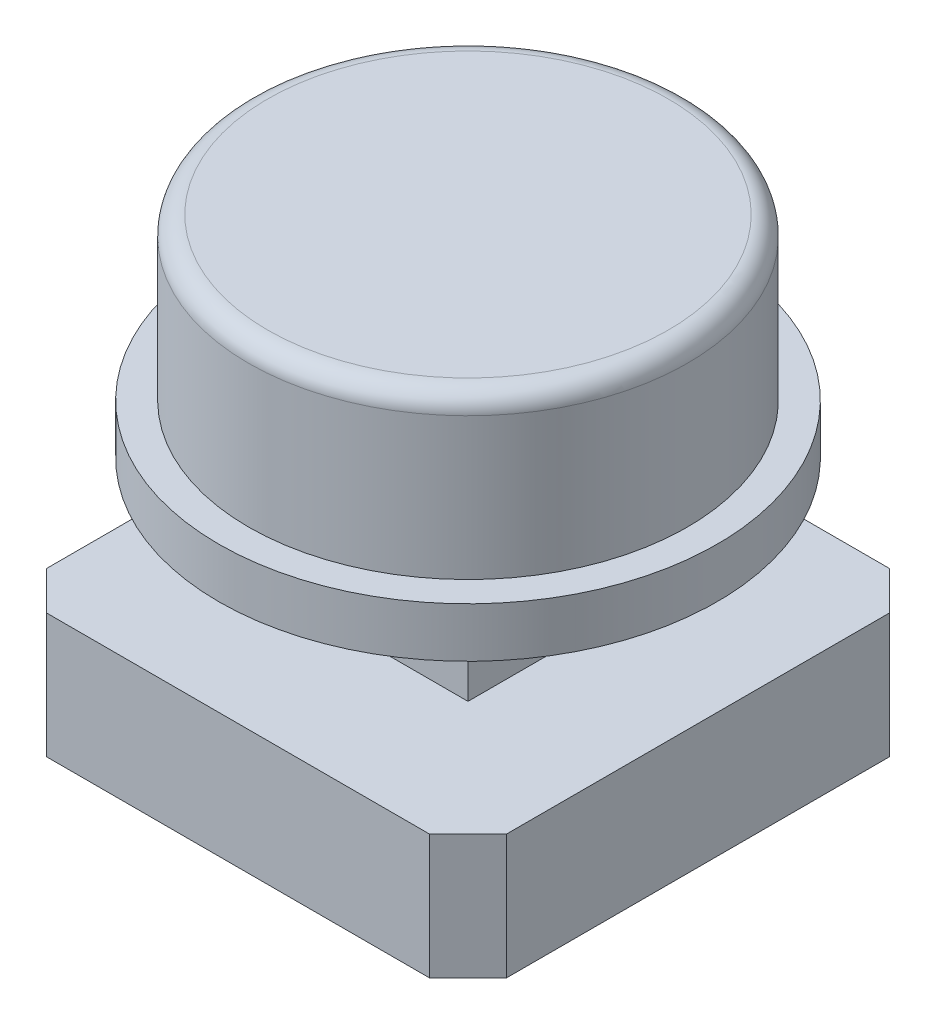
ISO-10303-21;
HEADER;
FILE_DESCRIPTION(('STEP AP214'),'2;1');
FILE_NAME('part.step','',(''),(''),'','','');
FILE_SCHEMA(('AUTOMOTIVE_DESIGN { 1 0 10303 214 1 1 1 1 }'));
ENDSEC;
DATA;
#1=APPLICATION_CONTEXT('core data for automotive mechanical design processes');
#2=APPLICATION_PROTOCOL_DEFINITION('international standard','automotive_design',2000,#1);
#3=PRODUCT_CONTEXT('',#1,'mechanical');
#4=PRODUCT('Part','Part','',(#3));
#5=PRODUCT_RELATED_PRODUCT_CATEGORY('part','',(#4));
#6=PRODUCT_DEFINITION_FORMATION('','',#4);
#7=PRODUCT_DEFINITION_CONTEXT('part definition',#1,'design');
#8=PRODUCT_DEFINITION('design','',#6,#7);
#9=PRODUCT_DEFINITION_SHAPE('','',#8);
#10=(LENGTH_UNIT() NAMED_UNIT(*) SI_UNIT(.MILLI.,.METRE.));
#11=(NAMED_UNIT(*) PLANE_ANGLE_UNIT() SI_UNIT($,.RADIAN.));
#12=(NAMED_UNIT(*) SI_UNIT($,.STERADIAN.) SOLID_ANGLE_UNIT());
#13=UNCERTAINTY_MEASURE_WITH_UNIT(LENGTH_MEASURE(1.E-05),#10,'distance_accuracy_value','');
#14=(GEOMETRIC_REPRESENTATION_CONTEXT(3) GLOBAL_UNCERTAINTY_ASSIGNED_CONTEXT((#13)) GLOBAL_UNIT_ASSIGNED_CONTEXT((#10,
#11,#12)) REPRESENTATION_CONTEXT('',''));
#15=CARTESIAN_POINT('',(0.,0.,0.));
#16=DIRECTION('',(0.,0.,1.));
#17=DIRECTION('',(1.,0.,0.));
#18=AXIS2_PLACEMENT_3D('',#15,#16,#17);
#19=CARTESIAN_POINT('',(0.,11.75,0.));
#20=DIRECTION('',(0.,-1.,0.));
#21=DIRECTION('',(0.,0.,-1.));
#22=AXIS2_PLACEMENT_3D('',#19,#20,#21);
#23=CYLINDRICAL_SURFACE('',#22,6.5);
#24=CARTESIAN_POINT('',(0.,6.25,0.));
#25=DIRECTION('',(0.,1.,0.));
#26=DIRECTION('',(0.,0.,1.));
#27=AXIS2_PLACEMENT_3D('',#24,#25,#26);
#28=CIRCLE('',#27,6.5);
#29=CARTESIAN_POINT('',(0.,6.25,6.5));
#30=VERTEX_POINT('',#29);
#31=EDGE_CURVE('E169',#30,#30,#28,.T.);
#32=ORIENTED_EDGE('',*,*,#31,.T.);
#33=EDGE_LOOP('',(#32));
#34=FACE_BOUND('',#33,.T.);
#35=CARTESIAN_POINT('',(0.,7.55,0.));
#36=DIRECTION('',(0.,1.,0.));
#37=DIRECTION('',(0.,0.,1.));
#38=AXIS2_PLACEMENT_3D('',#35,#36,#37);
#39=CIRCLE('',#38,6.5);
#40=CARTESIAN_POINT('',(0.,7.55,6.5));
#41=VERTEX_POINT('',#40);
#42=EDGE_CURVE('E454',#41,#41,#39,.T.);
#43=ORIENTED_EDGE('',*,*,#42,.F.);
#44=EDGE_LOOP('',(#43));
#45=FACE_BOUND('',#44,.T.);
#46=ADVANCED_FACE('F47',(#34,#45),#23,.T.);
#47=CARTESIAN_POINT('',(-6.,3.25,6.));
#48=DIRECTION('',(1.,0.,0.));
#49=DIRECTION('',(0.,0.,-1.));
#50=AXIS2_PLACEMENT_3D('',#47,#48,#49);
#51=PLANE('',#50);
#52=DIRECTION('',(0.,0.,1.));
#53=VECTOR('',#52,1.);
#54=CARTESIAN_POINT('',(-6.,3.25,6.));
#55=LINE('',#54,#53);
#56=CARTESIAN_POINT('',(-6.,3.25,-4.99999999999999));
#57=VERTEX_POINT('',#56);
#58=CARTESIAN_POINT('',(-6.,3.25,5.));
#59=VERTEX_POINT('',#58);
#60=EDGE_CURVE('E187',#57,#59,#55,.T.);
#61=ORIENTED_EDGE('',*,*,#60,.F.);
#62=DIRECTION('',(0.,-1.,0.));
#63=VECTOR('',#62,1.);
#64=CARTESIAN_POINT('',(-6.,3.25,-4.99999999999999));
#65=LINE('',#64,#63);
#66=CARTESIAN_POINT('',(-6.,0.,-4.99999999999999));
#67=VERTEX_POINT('',#66);
#68=EDGE_CURVE('E221',#57,#67,#65,.T.);
#69=ORIENTED_EDGE('',*,*,#68,.T.);
#70=DIRECTION('',(0.,0.,1.));
#71=VECTOR('',#70,1.);
#72=CARTESIAN_POINT('',(-6.,0.,6.));
#73=LINE('',#72,#71);
#74=CARTESIAN_POINT('',(-6.,0.,5.));
#75=VERTEX_POINT('',#74);
#76=EDGE_CURVE('E186',#67,#75,#73,.T.);
#77=ORIENTED_EDGE('',*,*,#76,.T.);
#78=DIRECTION('',(0.,1.,0.));
#79=VECTOR('',#78,1.);
#80=CARTESIAN_POINT('',(-6.,3.25,5.));
#81=LINE('',#80,#79);
#82=EDGE_CURVE('E204',#75,#59,#81,.T.);
#83=ORIENTED_EDGE('',*,*,#82,.T.);
#84=EDGE_LOOP('',(#61,#69,#77,#83));
#85=FACE_BOUND('',#84,.T.);
#86=ADVANCED_FACE('F284',(#85),#51,.F.);
#87=CARTESIAN_POINT('',(6.,3.25,6.));
#88=DIRECTION('',(0.,0.,-1.));
#89=DIRECTION('',(-1.,0.,0.));
#90=AXIS2_PLACEMENT_3D('',#87,#88,#89);
#91=PLANE('',#90);
#92=DIRECTION('',(1.,0.,0.));
#93=VECTOR('',#92,1.);
#94=CARTESIAN_POINT('',(6.,0.,6.));
#95=LINE('',#94,#93);
#96=CARTESIAN_POINT('',(-5.,0.,6.));
#97=VERTEX_POINT('',#96);
#98=CARTESIAN_POINT('',(5.,0.,6.));
#99=VERTEX_POINT('',#98);
#100=EDGE_CURVE('E208',#97,#99,#95,.T.);
#101=ORIENTED_EDGE('',*,*,#100,.T.);
#102=DIRECTION('',(0.,1.,0.));
#103=VECTOR('',#102,1.);
#104=CARTESIAN_POINT('',(5.,3.25,6.));
#105=LINE('',#104,#103);
#106=CARTESIAN_POINT('',(5.,3.25,6.));
#107=VERTEX_POINT('',#106);
#108=EDGE_CURVE('E267',#99,#107,#105,.T.);
#109=ORIENTED_EDGE('',*,*,#108,.T.);
#110=DIRECTION('',(1.,0.,0.));
#111=VECTOR('',#110,1.);
#112=CARTESIAN_POINT('',(6.,3.25,6.));
#113=LINE('',#112,#111);
#114=CARTESIAN_POINT('',(-5.,3.25,6.));
#115=VERTEX_POINT('',#114);
#116=EDGE_CURVE('E191',#115,#107,#113,.T.);
#117=ORIENTED_EDGE('',*,*,#116,.F.);
#118=DIRECTION('',(0.,-1.,0.));
#119=VECTOR('',#118,1.);
#120=CARTESIAN_POINT('',(-5.,3.25,6.));
#121=LINE('',#120,#119);
#122=EDGE_CURVE('E263',#115,#97,#121,.T.);
#123=ORIENTED_EDGE('',*,*,#122,.T.);
#124=EDGE_LOOP('',(#101,#109,#117,#123));
#125=FACE_BOUND('',#124,.T.);
#126=ADVANCED_FACE('F292',(#125),#91,.F.);
#127=CARTESIAN_POINT('',(6.,3.25,6.));
#128=DIRECTION('',(-1.,0.,0.));
#129=DIRECTION('',(0.,0.,1.));
#130=AXIS2_PLACEMENT_3D('',#127,#128,#129);
#131=PLANE('',#130);
#132=DIRECTION('',(0.,0.,-1.));
#133=VECTOR('',#132,1.);
#134=CARTESIAN_POINT('',(6.,0.,6.));
#135=LINE('',#134,#133);
#136=CARTESIAN_POINT('',(6.,0.,5.));
#137=VERTEX_POINT('',#136);
#138=CARTESIAN_POINT('',(6.,0.,-4.99999999999999));
#139=VERTEX_POINT('',#138);
#140=EDGE_CURVE('E212',#137,#139,#135,.T.);
#141=ORIENTED_EDGE('',*,*,#140,.T.);
#142=DIRECTION('',(0.,1.,0.));
#143=VECTOR('',#142,1.);
#144=CARTESIAN_POINT('',(6.,3.25,-4.99999999999999));
#145=LINE('',#144,#143);
#146=CARTESIAN_POINT('',(6.,3.25,-4.99999999999999));
#147=VERTEX_POINT('',#146);
#148=EDGE_CURVE('E260',#139,#147,#145,.T.);
#149=ORIENTED_EDGE('',*,*,#148,.T.);
#150=DIRECTION('',(0.,0.,-1.));
#151=VECTOR('',#150,1.);
#152=CARTESIAN_POINT('',(6.,3.25,6.));
#153=LINE('',#152,#151);
#154=CARTESIAN_POINT('',(6.,3.25,5.));
#155=VERTEX_POINT('',#154);
#156=EDGE_CURVE('E196',#155,#147,#153,.T.);
#157=ORIENTED_EDGE('',*,*,#156,.F.);
#158=DIRECTION('',(0.,-1.,0.));
#159=VECTOR('',#158,1.);
#160=CARTESIAN_POINT('',(6.,3.25,5.));
#161=LINE('',#160,#159);
#162=EDGE_CURVE('E256',#155,#137,#161,.T.);
#163=ORIENTED_EDGE('',*,*,#162,.T.);
#164=EDGE_LOOP('',(#141,#149,#157,#163));
#165=FACE_BOUND('',#164,.T.);
#166=ADVANCED_FACE('F323',(#165),#131,.F.);
#167=CARTESIAN_POINT('',(6.,3.25,-6.));
#168=DIRECTION('',(0.,0.,1.));
#169=DIRECTION('',(1.,0.,0.));
#170=AXIS2_PLACEMENT_3D('',#167,#168,#169);
#171=PLANE('',#170);
#172=DIRECTION('',(-1.,0.,0.));
#173=VECTOR('',#172,1.);
#174=CARTESIAN_POINT('',(6.,0.,-6.));
#175=LINE('',#174,#173);
#176=CARTESIAN_POINT('',(5.,0.,-6.));
#177=VERTEX_POINT('',#176);
#178=CARTESIAN_POINT('',(-4.99999999999999,0.,-6.));
#179=VERTEX_POINT('',#178);
#180=EDGE_CURVE('E192',#177,#179,#175,.T.);
#181=ORIENTED_EDGE('',*,*,#180,.T.);
#182=DIRECTION('',(0.,1.,0.));
#183=VECTOR('',#182,1.);
#184=CARTESIAN_POINT('',(-4.99999999999999,3.25,-6.));
#185=LINE('',#184,#183);
#186=CARTESIAN_POINT('',(-4.99999999999999,3.25,-6.));
#187=VERTEX_POINT('',#186);
#188=EDGE_CURVE('E241',#179,#187,#185,.T.);
#189=ORIENTED_EDGE('',*,*,#188,.T.);
#190=DIRECTION('',(-1.,0.,0.));
#191=VECTOR('',#190,1.);
#192=CARTESIAN_POINT('',(6.,3.25,-6.));
#193=LINE('',#192,#191);
#194=CARTESIAN_POINT('',(5.,3.25,-6.));
#195=VERTEX_POINT('',#194);
#196=EDGE_CURVE('E200',#195,#187,#193,.T.);
#197=ORIENTED_EDGE('',*,*,#196,.F.);
#198=DIRECTION('',(0.,-1.,0.));
#199=VECTOR('',#198,1.);
#200=CARTESIAN_POINT('',(5.,3.25,-6.));
#201=LINE('',#200,#199);
#202=EDGE_CURVE('E237',#195,#177,#201,.T.);
#203=ORIENTED_EDGE('',*,*,#202,.T.);
#204=EDGE_LOOP('',(#181,#189,#197,#203));
#205=FACE_BOUND('',#204,.T.);
#206=ADVANCED_FACE('F316',(#205),#171,.F.);
#207=CARTESIAN_POINT('',(0.,3.25,0.));
#208=DIRECTION('',(0.,1.,0.));
#209=DIRECTION('',(0.,0.,1.));
#210=AXIS2_PLACEMENT_3D('',#207,#208,#209);
#211=PLANE('',#210);
#212=DIRECTION('',(0.,0.,1.));
#213=VECTOR('',#212,1.);
#214=CARTESIAN_POINT('',(-2.5,3.25,2.5));
#215=LINE('',#214,#213);
#216=CARTESIAN_POINT('',(-2.5,3.25,-2.5));
#217=VERTEX_POINT('',#216);
#218=CARTESIAN_POINT('',(-2.5,3.25,2.5));
#219=VERTEX_POINT('',#218);
#220=EDGE_CURVE('E63',#217,#219,#215,.T.);
#221=ORIENTED_EDGE('',*,*,#220,.F.);
#222=DIRECTION('',(-1.,0.,0.));
#223=VECTOR('',#222,1.);
#224=CARTESIAN_POINT('',(2.5,3.25,-2.5));
#225=LINE('',#224,#223);
#226=CARTESIAN_POINT('',(2.5,3.25,-2.5));
#227=VERTEX_POINT('',#226);
#228=EDGE_CURVE('E67',#227,#217,#225,.T.);
#229=ORIENTED_EDGE('',*,*,#228,.F.);
#230=DIRECTION('',(0.,0.,-1.));
#231=VECTOR('',#230,1.);
#232=CARTESIAN_POINT('',(2.5,3.25,2.5));
#233=LINE('',#232,#231);
#234=CARTESIAN_POINT('',(2.5,3.25,2.5));
#235=VERTEX_POINT('',#234);
#236=EDGE_CURVE('E173',#235,#227,#233,.T.);
#237=ORIENTED_EDGE('',*,*,#236,.F.);
#238=DIRECTION('',(1.,0.,0.));
#239=VECTOR('',#238,1.);
#240=CARTESIAN_POINT('',(2.5,3.25,2.5));
#241=LINE('',#240,#239);
#242=EDGE_CURVE('E168',#219,#235,#241,.T.);
#243=ORIENTED_EDGE('',*,*,#242,.F.);
#244=EDGE_LOOP('',(#221,#229,#237,#243));
#245=FACE_BOUND('',#244,.T.);
#246=ORIENTED_EDGE('',*,*,#196,.T.);
#247=DIRECTION('',(0.707106781186548,0.,-0.707106781186547));
#248=VECTOR('',#247,1.);
#249=CARTESIAN_POINT('',(-5.49999999999999,3.25,-5.5));
#250=LINE('',#249,#248);
#251=EDGE_CURVE('E253',#187,#57,#250,.F.);
#252=ORIENTED_EDGE('',*,*,#251,.T.);
#253=ORIENTED_EDGE('',*,*,#60,.T.);
#254=DIRECTION('',(-0.707106781186548,0.,-0.707106781186547));
#255=VECTOR('',#254,1.);
#256=CARTESIAN_POINT('',(-5.5,3.25,5.5));
#257=LINE('',#256,#255);
#258=EDGE_CURVE('E244',#59,#115,#257,.F.);
#259=ORIENTED_EDGE('',*,*,#258,.T.);
#260=ORIENTED_EDGE('',*,*,#116,.T.);
#261=DIRECTION('',(-0.707106781186549,0.,0.707106781186546));
#262=VECTOR('',#261,1.);
#263=CARTESIAN_POINT('',(5.49999999999999,3.25,5.50000000000001));
#264=LINE('',#263,#262);
#265=EDGE_CURVE('E247',#107,#155,#264,.F.);
#266=ORIENTED_EDGE('',*,*,#265,.T.);
#267=ORIENTED_EDGE('',*,*,#156,.T.);
#268=DIRECTION('',(0.707106781186546,0.,0.707106781186549));
#269=VECTOR('',#268,1.);
#270=CARTESIAN_POINT('',(5.50000000000001,3.25,-5.49999999999999));
#271=LINE('',#270,#269);
#272=EDGE_CURVE('E250',#147,#195,#271,.F.);
#273=ORIENTED_EDGE('',*,*,#272,.T.);
#274=EDGE_LOOP('',(#246,#252,#253,#259,#260,#266,#267,#273));
#275=FACE_BOUND('',#274,.T.);
#276=ADVANCED_FACE('F312',(#245,#275),#211,.T.);
#277=CARTESIAN_POINT('',(0.,0.,0.));
#278=DIRECTION('',(0.,1.,0.));
#279=DIRECTION('',(0.,0.,1.));
#280=AXIS2_PLACEMENT_3D('',#277,#278,#279);
#281=PLANE('',#280);
#282=ORIENTED_EDGE('',*,*,#76,.F.);
#283=DIRECTION('',(-0.707106781186548,0.,0.707106781186547));
#284=VECTOR('',#283,1.);
#285=CARTESIAN_POINT('',(-6.,0.,-4.99999999999999));
#286=LINE('',#285,#284);
#287=EDGE_CURVE('E234',#67,#179,#286,.F.);
#288=ORIENTED_EDGE('',*,*,#287,.T.);
#289=ORIENTED_EDGE('',*,*,#180,.F.);
#290=DIRECTION('',(-0.707106781186546,0.,-0.707106781186549));
#291=VECTOR('',#290,1.);
#292=CARTESIAN_POINT('',(5.,0.,-6.));
#293=LINE('',#292,#291);
#294=EDGE_CURVE('E231',#177,#139,#293,.F.);
#295=ORIENTED_EDGE('',*,*,#294,.T.);
#296=ORIENTED_EDGE('',*,*,#140,.F.);
#297=DIRECTION('',(0.707106781186549,0.,-0.707106781186546));
#298=VECTOR('',#297,1.);
#299=CARTESIAN_POINT('',(6.,0.,5.));
#300=LINE('',#299,#298);
#301=EDGE_CURVE('E228',#137,#99,#300,.F.);
#302=ORIENTED_EDGE('',*,*,#301,.T.);
#303=ORIENTED_EDGE('',*,*,#100,.F.);
#304=DIRECTION('',(0.707106781186548,0.,0.707106781186547));
#305=VECTOR('',#304,1.);
#306=CARTESIAN_POINT('',(-5.,0.,6.));
#307=LINE('',#306,#305);
#308=EDGE_CURVE('E225',#97,#75,#307,.F.);
#309=ORIENTED_EDGE('',*,*,#308,.T.);
#310=EDGE_LOOP('',(#282,#288,#289,#295,#296,#302,#303,#309));
#311=FACE_BOUND('',#310,.T.);
#312=ADVANCED_FACE('F315',(#311),#281,.F.);
#313=CARTESIAN_POINT('',(-6.,3.25,-4.99999999999999));
#314=DIRECTION('',(0.707106781186547,0.,0.707106781186548));
#315=DIRECTION('',(0.,-1.,0.));
#316=AXIS2_PLACEMENT_3D('',#313,#314,#315);
#317=PLANE('',#316);
#318=ORIENTED_EDGE('',*,*,#251,.F.);
#319=ORIENTED_EDGE('',*,*,#188,.F.);
#320=ORIENTED_EDGE('',*,*,#287,.F.);
#321=ORIENTED_EDGE('',*,*,#68,.F.);
#322=EDGE_LOOP('',(#318,#319,#320,#321));
#323=FACE_BOUND('',#322,.T.);
#324=ADVANCED_FACE('F319',(#323),#317,.F.);
#325=CARTESIAN_POINT('',(5.,3.25,-6.));
#326=DIRECTION('',(-0.707106781186549,0.,0.707106781186546));
#327=DIRECTION('',(0.,-1.,0.));
#328=AXIS2_PLACEMENT_3D('',#325,#326,#327);
#329=PLANE('',#328);
#330=ORIENTED_EDGE('',*,*,#272,.F.);
#331=ORIENTED_EDGE('',*,*,#148,.F.);
#332=ORIENTED_EDGE('',*,*,#294,.F.);
#333=ORIENTED_EDGE('',*,*,#202,.F.);
#334=EDGE_LOOP('',(#330,#331,#332,#333));
#335=FACE_BOUND('',#334,.T.);
#336=ADVANCED_FACE('F337',(#335),#329,.F.);
#337=CARTESIAN_POINT('',(6.,3.25,5.));
#338=DIRECTION('',(-0.707106781186546,0.,-0.707106781186549));
#339=DIRECTION('',(0.,-1.,0.));
#340=AXIS2_PLACEMENT_3D('',#337,#338,#339);
#341=PLANE('',#340);
#342=ORIENTED_EDGE('',*,*,#265,.F.);
#343=ORIENTED_EDGE('',*,*,#108,.F.);
#344=ORIENTED_EDGE('',*,*,#301,.F.);
#345=ORIENTED_EDGE('',*,*,#162,.F.);
#346=EDGE_LOOP('',(#342,#343,#344,#345));
#347=FACE_BOUND('',#346,.T.);
#348=ADVANCED_FACE('F344',(#347),#341,.F.);
#349=CARTESIAN_POINT('',(-5.,3.25,6.));
#350=DIRECTION('',(0.707106781186547,0.,-0.707106781186548));
#351=DIRECTION('',(0.,-1.,0.));
#352=AXIS2_PLACEMENT_3D('',#349,#350,#351);
#353=PLANE('',#352);
#354=ORIENTED_EDGE('',*,*,#258,.F.);
#355=ORIENTED_EDGE('',*,*,#82,.F.);
#356=ORIENTED_EDGE('',*,*,#308,.F.);
#357=ORIENTED_EDGE('',*,*,#122,.F.);
#358=EDGE_LOOP('',(#354,#355,#356,#357));
#359=FACE_BOUND('',#358,.T.);
#360=ADVANCED_FACE('F311',(#359),#353,.F.);
#361=CARTESIAN_POINT('',(-2.5,6.25,2.5));
#362=DIRECTION('',(1.,0.,0.));
#363=DIRECTION('',(0.,0.,-1.));
#364=AXIS2_PLACEMENT_3D('',#361,#362,#363);
#365=PLANE('',#364);
#366=ORIENTED_EDGE('',*,*,#220,.T.);
#367=DIRECTION('',(0.,-1.,0.));
#368=VECTOR('',#367,1.);
#369=CARTESIAN_POINT('',(-2.5,6.25,2.5));
#370=LINE('',#369,#368);
#371=CARTESIAN_POINT('',(-2.5,6.25,2.5));
#372=VERTEX_POINT('',#371);
#373=EDGE_CURVE('E141',#372,#219,#370,.T.);
#374=ORIENTED_EDGE('',*,*,#373,.F.);
#375=DIRECTION('',(0.,0.,1.));
#376=VECTOR('',#375,1.);
#377=CARTESIAN_POINT('',(-2.5,6.25,2.5));
#378=LINE('',#377,#376);
#379=CARTESIAN_POINT('',(-2.5,6.25,-2.5));
#380=VERTEX_POINT('',#379);
#381=EDGE_CURVE('E136',#380,#372,#378,.T.);
#382=ORIENTED_EDGE('',*,*,#381,.F.);
#383=DIRECTION('',(0.,-1.,0.));
#384=VECTOR('',#383,1.);
#385=CARTESIAN_POINT('',(-2.5,6.25,-2.5));
#386=LINE('',#385,#384);
#387=EDGE_CURVE('E139',#380,#217,#386,.T.);
#388=ORIENTED_EDGE('',*,*,#387,.T.);
#389=EDGE_LOOP('',(#366,#374,#382,#388));
#390=FACE_BOUND('',#389,.T.);
#391=ADVANCED_FACE('F138',(#390),#365,.F.);
#392=CARTESIAN_POINT('',(2.5,6.25,2.5));
#393=DIRECTION('',(0.,0.,-1.));
#394=DIRECTION('',(-1.,0.,0.));
#395=AXIS2_PLACEMENT_3D('',#392,#393,#394);
#396=PLANE('',#395);
#397=ORIENTED_EDGE('',*,*,#242,.T.);
#398=DIRECTION('',(0.,-1.,0.));
#399=VECTOR('',#398,1.);
#400=CARTESIAN_POINT('',(2.5,6.25,2.5));
#401=LINE('',#400,#399);
#402=CARTESIAN_POINT('',(2.5,6.25,2.5));
#403=VERTEX_POINT('',#402);
#404=EDGE_CURVE('E180',#403,#235,#401,.T.);
#405=ORIENTED_EDGE('',*,*,#404,.F.);
#406=DIRECTION('',(1.,0.,0.));
#407=VECTOR('',#406,1.);
#408=CARTESIAN_POINT('',(2.5,6.25,2.5));
#409=LINE('',#408,#407);
#410=EDGE_CURVE('E146',#372,#403,#409,.T.);
#411=ORIENTED_EDGE('',*,*,#410,.F.);
#412=ORIENTED_EDGE('',*,*,#373,.T.);
#413=EDGE_LOOP('',(#397,#405,#411,#412));
#414=FACE_BOUND('',#413,.T.);
#415=ADVANCED_FACE('F304',(#414),#396,.F.);
#416=CARTESIAN_POINT('',(2.5,6.25,2.5));
#417=DIRECTION('',(-1.,0.,0.));
#418=DIRECTION('',(0.,0.,1.));
#419=AXIS2_PLACEMENT_3D('',#416,#417,#418);
#420=PLANE('',#419);
#421=ORIENTED_EDGE('',*,*,#236,.T.);
#422=DIRECTION('',(0.,-1.,0.));
#423=VECTOR('',#422,1.);
#424=CARTESIAN_POINT('',(2.5,6.25,-2.5));
#425=LINE('',#424,#423);
#426=CARTESIAN_POINT('',(2.5,6.25,-2.5));
#427=VERTEX_POINT('',#426);
#428=EDGE_CURVE('E155',#427,#227,#425,.T.);
#429=ORIENTED_EDGE('',*,*,#428,.F.);
#430=DIRECTION('',(0.,0.,-1.));
#431=VECTOR('',#430,1.);
#432=CARTESIAN_POINT('',(2.5,6.25,2.5));
#433=LINE('',#432,#431);
#434=EDGE_CURVE('E159',#403,#427,#433,.T.);
#435=ORIENTED_EDGE('',*,*,#434,.F.);
#436=ORIENTED_EDGE('',*,*,#404,.T.);
#437=EDGE_LOOP('',(#421,#429,#435,#436));
#438=FACE_BOUND('',#437,.T.);
#439=ADVANCED_FACE('F301',(#438),#420,.F.);
#440=CARTESIAN_POINT('',(2.5,6.25,-2.5));
#441=DIRECTION('',(0.,0.,1.));
#442=DIRECTION('',(1.,0.,0.));
#443=AXIS2_PLACEMENT_3D('',#440,#441,#442);
#444=PLANE('',#443);
#445=ORIENTED_EDGE('',*,*,#228,.T.);
#446=ORIENTED_EDGE('',*,*,#387,.F.);
#447=DIRECTION('',(-1.,0.,0.));
#448=VECTOR('',#447,1.);
#449=CARTESIAN_POINT('',(2.5,6.25,-2.5));
#450=LINE('',#449,#448);
#451=EDGE_CURVE('E152',#427,#380,#450,.T.);
#452=ORIENTED_EDGE('',*,*,#451,.F.);
#453=ORIENTED_EDGE('',*,*,#428,.T.);
#454=EDGE_LOOP('',(#445,#446,#452,#453));
#455=FACE_BOUND('',#454,.T.);
#456=ADVANCED_FACE('F150',(#455),#444,.F.);
#457=CARTESIAN_POINT('',(0.,6.25,0.));
#458=DIRECTION('',(0.,1.,0.));
#459=DIRECTION('',(0.,0.,1.));
#460=AXIS2_PLACEMENT_3D('',#457,#458,#459);
#461=PLANE('',#460);
#462=ORIENTED_EDGE('',*,*,#31,.F.);
#463=EDGE_LOOP('',(#462));
#464=FACE_BOUND('',#463,.T.);
#465=ORIENTED_EDGE('',*,*,#451,.T.);
#466=ORIENTED_EDGE('',*,*,#381,.T.);
#467=ORIENTED_EDGE('',*,*,#410,.T.);
#468=ORIENTED_EDGE('',*,*,#434,.T.);
#469=EDGE_LOOP('',(#465,#466,#467,#468));
#470=FACE_BOUND('',#469,.T.);
#471=ADVANCED_FACE('F157',(#464,#470),#461,.F.);
#472=CARTESIAN_POINT('',(0.,7.55,0.));
#473=DIRECTION('',(0.,1.,0.));
#474=DIRECTION('',(0.,0.,1.));
#475=AXIS2_PLACEMENT_3D('',#472,#473,#474);
#476=PLANE('',#475);
#477=CARTESIAN_POINT('',(0.,7.55,0.));
#478=DIRECTION('',(0.,1.,0.));
#479=DIRECTION('',(0.,0.,1.));
#480=AXIS2_PLACEMENT_3D('',#477,#478,#479);
#481=CIRCLE('',#480,5.725);
#482=CARTESIAN_POINT('',(0.,7.55,5.725));
#483=VERTEX_POINT('',#482);
#484=EDGE_CURVE('E452',#483,#483,#481,.T.);
#485=ORIENTED_EDGE('',*,*,#484,.F.);
#486=EDGE_LOOP('',(#485));
#487=FACE_BOUND('',#486,.T.);
#488=ORIENTED_EDGE('',*,*,#42,.T.);
#489=EDGE_LOOP('',(#488));
#490=FACE_BOUND('',#489,.T.);
#491=ADVANCED_FACE('F412',(#487,#490),#476,.T.);
#492=CARTESIAN_POINT('',(0.,7.55,0.));
#493=DIRECTION('',(0.,1.,0.));
#494=DIRECTION('',(0.,0.,1.));
#495=AXIS2_PLACEMENT_3D('',#492,#493,#494);
#496=CYLINDRICAL_SURFACE('',#495,5.725);
#497=CARTESIAN_POINT('',(0.,11.25,0.));
#498=DIRECTION('',(0.,1.,0.));
#499=DIRECTION('',(0.,0.,1.));
#500=AXIS2_PLACEMENT_3D('',#497,#498,#499);
#501=CIRCLE('',#500,5.725);
#502=CARTESIAN_POINT('',(0.,11.25,5.725));
#503=VERTEX_POINT('',#502);
#504=EDGE_CURVE('E12',#503,#503,#501,.F.);
#505=ORIENTED_EDGE('',*,*,#504,.T.);
#506=EDGE_LOOP('',(#505));
#507=FACE_BOUND('',#506,.T.);
#508=ORIENTED_EDGE('',*,*,#484,.T.);
#509=EDGE_LOOP('',(#508));
#510=FACE_BOUND('',#509,.T.);
#511=ADVANCED_FACE('F280',(#507,#510),#496,.T.);
#512=CARTESIAN_POINT('',(0.,11.75,0.));
#513=DIRECTION('',(0.,1.,0.));
#514=DIRECTION('',(0.,0.,1.));
#515=AXIS2_PLACEMENT_3D('',#512,#513,#514);
#516=PLANE('',#515);
#517=CARTESIAN_POINT('',(0.,11.75,0.));
#518=DIRECTION('',(0.,1.,0.));
#519=DIRECTION('',(0.,0.,1.));
#520=AXIS2_PLACEMENT_3D('',#517,#518,#519);
#521=CIRCLE('',#520,5.225);
#522=CARTESIAN_POINT('',(0.,11.75,5.225));
#523=VERTEX_POINT('',#522);
#524=EDGE_CURVE('E56',#523,#523,#521,.T.);
#525=ORIENTED_EDGE('',*,*,#524,.T.);
#526=EDGE_LOOP('',(#525));
#527=FACE_BOUND('',#526,.T.);
#528=ADVANCED_FACE('F273',(#527),#516,.T.);
#529=CARTESIAN_POINT('',(0.,11.25,0.));
#530=DIRECTION('',(0.,1.,0.));
#531=DIRECTION('',(0.,0.,1.));
#532=AXIS2_PLACEMENT_3D('',#529,#530,#531);
#533=TOROIDAL_SURFACE('',#532,5.225,0.5);
#534=ORIENTED_EDGE('',*,*,#504,.F.);
#535=EDGE_LOOP('',(#534));
#536=FACE_BOUND('',#535,.T.);
#537=ORIENTED_EDGE('',*,*,#524,.F.);
#538=EDGE_LOOP('',(#537));
#539=FACE_BOUND('',#538,.T.);
#540=ADVANCED_FACE('F49',(#536,#539),#533,.T.);
#541=CLOSED_SHELL('',(#46,#86,#126,#166,#206,#276,#312,#324,#336,#348,#360,#391,#415,#439,#456,
#471,#491,#511,#528,#540));
#542=MANIFOLD_SOLID_BREP('B2',#541);
#543=ADVANCED_BREP_SHAPE_REPRESENTATION('',(#18,#542),#14);
#544=SHAPE_DEFINITION_REPRESENTATION(#9,#543);
ENDSEC;
END-ISO-10303-21;
